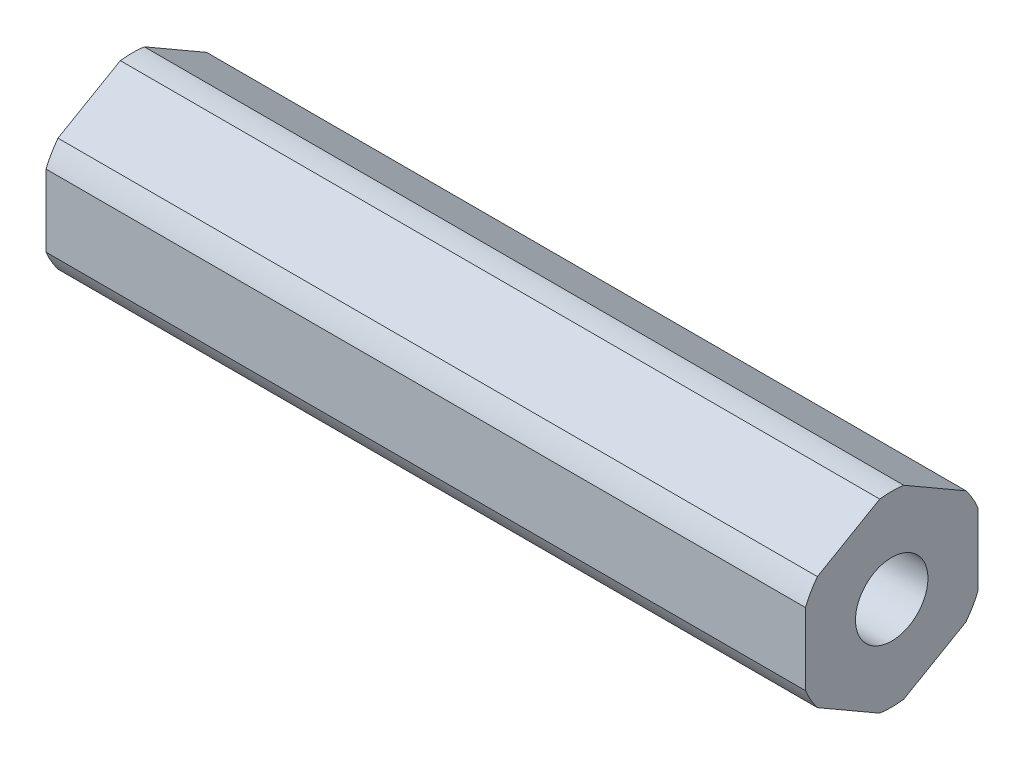
ISO-10303-21;
HEADER;
FILE_DESCRIPTION(('STEP AP214'),'2;1');
FILE_NAME('part.step','',(''),(''),'','','');
FILE_SCHEMA(('AUTOMOTIVE_DESIGN { 1 0 10303 214 1 1 1 1 }'));
ENDSEC;
DATA;
#1=APPLICATION_CONTEXT('core data for automotive mechanical design processes');
#2=APPLICATION_PROTOCOL_DEFINITION('international standard','automotive_design',2000,#1);
#3=PRODUCT_CONTEXT('',#1,'mechanical');
#4=PRODUCT('Part','Part','',(#3));
#5=PRODUCT_RELATED_PRODUCT_CATEGORY('part','',(#4));
#6=PRODUCT_DEFINITION_FORMATION('','',#4);
#7=PRODUCT_DEFINITION_CONTEXT('part definition',#1,'design');
#8=PRODUCT_DEFINITION('design','',#6,#7);
#9=PRODUCT_DEFINITION_SHAPE('','',#8);
#10=(LENGTH_UNIT() NAMED_UNIT(*) SI_UNIT(.MILLI.,.METRE.));
#11=(NAMED_UNIT(*) PLANE_ANGLE_UNIT() SI_UNIT($,.RADIAN.));
#12=(NAMED_UNIT(*) SI_UNIT($,.STERADIAN.) SOLID_ANGLE_UNIT());
#13=UNCERTAINTY_MEASURE_WITH_UNIT(LENGTH_MEASURE(1.E-05),#10,'distance_accuracy_value','');
#14=(GEOMETRIC_REPRESENTATION_CONTEXT(3) GLOBAL_UNCERTAINTY_ASSIGNED_CONTEXT((#13)) GLOBAL_UNIT_ASSIGNED_CONTEXT((#10,
#11,#12)) REPRESENTATION_CONTEXT('',''));
#15=CARTESIAN_POINT('',(0.,0.,0.));
#16=DIRECTION('',(0.,0.,1.));
#17=DIRECTION('',(1.,0.,0.));
#18=AXIS2_PLACEMENT_3D('',#15,#16,#17);
#19=CARTESIAN_POINT('',(14.605,0.,5.64652491430451E-13));
#20=DIRECTION('',(-1.,0.,0.));
#21=DIRECTION('',(0.,0.,1.));
#22=AXIS2_PLACEMENT_3D('',#19,#20,#21);
#23=CYLINDRICAL_SURFACE('',#22,6.88000000000029);
#24=CARTESIAN_POINT('',(-41.275,0.,5.64652491430451E-13));
#25=DIRECTION('',(-1.,0.,0.));
#26=DIRECTION('',(0.,0.,1.));
#27=AXIS2_PLACEMENT_3D('',#24,#25,#26);
#28=CIRCLE('',#27,6.88000000000029);
#29=CARTESIAN_POINT('',(-41.275,-2.64799924471228,-6.35));
#30=VERTEX_POINT('',#29);
#31=CARTESIAN_POINT('',(-41.275,-4.17526169167448,-5.46823461512336));
#32=VERTEX_POINT('',#31);
#33=EDGE_CURVE('E154',#30,#32,#28,.T.);
#34=ORIENTED_EDGE('',*,*,#33,.F.);
#35=DIRECTION('',(-1.,0.,0.));
#36=VECTOR('',#35,1.);
#37=CARTESIAN_POINT('',(14.605,-2.64799924471228,-6.35));
#38=LINE('',#37,#36);
#39=CARTESIAN_POINT('',(14.605,-2.64799924471228,-6.35));
#40=VERTEX_POINT('',#39);
#41=EDGE_CURVE('E11',#40,#30,#38,.T.);
#42=ORIENTED_EDGE('',*,*,#41,.F.);
#43=CARTESIAN_POINT('',(14.605,0.,5.64652491430451E-13));
#44=DIRECTION('',(-1.,0.,0.));
#45=DIRECTION('',(0.,0.,1.));
#46=AXIS2_PLACEMENT_3D('',#43,#44,#45);
#47=CIRCLE('',#46,6.88000000000029);
#48=CARTESIAN_POINT('',(14.605,-4.17526169167448,-5.46823461512336));
#49=VERTEX_POINT('',#48);
#50=EDGE_CURVE('E187',#40,#49,#47,.T.);
#51=ORIENTED_EDGE('',*,*,#50,.T.);
#52=DIRECTION('',(-1.,0.,0.));
#53=VECTOR('',#52,1.);
#54=CARTESIAN_POINT('',(14.605,-4.17526169167448,-5.46823461512336));
#55=LINE('',#54,#53);
#56=EDGE_CURVE('E36',#49,#32,#55,.T.);
#57=ORIENTED_EDGE('',*,*,#56,.T.);
#58=EDGE_LOOP('',(#34,#42,#51,#57));
#59=FACE_BOUND('',#58,.T.);
#60=ADVANCED_FACE('F33',(#59),#23,.T.);
#61=CARTESIAN_POINT('',(14.605,2.64799924471228,-6.35));
#62=DIRECTION('',(0.,0.,-1.));
#63=DIRECTION('',(-1.,0.,0.));
#64=AXIS2_PLACEMENT_3D('',#61,#62,#63);
#65=PLANE('',#64);
#66=DIRECTION('',(0.,-1.,0.));
#67=VECTOR('',#66,1.);
#68=CARTESIAN_POINT('',(-41.275,2.64799924471228,-6.35));
#69=LINE('',#68,#67);
#70=CARTESIAN_POINT('',(-41.275,2.64799924471228,-6.35));
#71=VERTEX_POINT('',#70);
#72=EDGE_CURVE('E185',#71,#30,#69,.T.);
#73=ORIENTED_EDGE('',*,*,#72,.F.);
#74=DIRECTION('',(-1.,0.,0.));
#75=VECTOR('',#74,1.);
#76=CARTESIAN_POINT('',(14.605,2.64799924471228,-6.35));
#77=LINE('',#76,#75);
#78=CARTESIAN_POINT('',(14.605,2.64799924471228,-6.35));
#79=VERTEX_POINT('',#78);
#80=EDGE_CURVE('E42',#79,#71,#77,.T.);
#81=ORIENTED_EDGE('',*,*,#80,.F.);
#82=DIRECTION('',(0.,-1.,0.));
#83=VECTOR('',#82,1.);
#84=CARTESIAN_POINT('',(14.605,2.64799924471228,-6.35));
#85=LINE('',#84,#83);
#86=EDGE_CURVE('E144',#79,#40,#85,.T.);
#87=ORIENTED_EDGE('',*,*,#86,.T.);
#88=ORIENTED_EDGE('',*,*,#41,.T.);
#89=EDGE_LOOP('',(#73,#81,#87,#88));
#90=FACE_BOUND('',#89,.T.);
#91=ADVANCED_FACE('F207',(#90),#65,.T.);
#92=CARTESIAN_POINT('',(14.605,0.,5.64652491430451E-13));
#93=DIRECTION('',(-1.,0.,0.));
#94=DIRECTION('',(0.,0.,1.));
#95=AXIS2_PLACEMENT_3D('',#92,#93,#94);
#96=CYLINDRICAL_SURFACE('',#95,6.88000000000029);
#97=CARTESIAN_POINT('',(-41.275,0.,5.64652491430451E-13));
#98=DIRECTION('',(-1.,0.,0.));
#99=DIRECTION('',(0.,0.,1.));
#100=AXIS2_PLACEMENT_3D('',#97,#98,#99);
#101=CIRCLE('',#100,6.88000000000029);
#102=CARTESIAN_POINT('',(-41.275,4.17526169167448,-5.46823461512336));
#103=VERTEX_POINT('',#102);
#104=EDGE_CURVE('E131',#103,#71,#101,.T.);
#105=ORIENTED_EDGE('',*,*,#104,.F.);
#106=DIRECTION('',(-1.,0.,0.));
#107=VECTOR('',#106,1.);
#108=CARTESIAN_POINT('',(14.605,4.17526169167448,-5.46823461512336));
#109=LINE('',#108,#107);
#110=CARTESIAN_POINT('',(14.605,4.17526169167448,-5.46823461512336));
#111=VERTEX_POINT('',#110);
#112=EDGE_CURVE('E126',#111,#103,#109,.T.);
#113=ORIENTED_EDGE('',*,*,#112,.F.);
#114=CARTESIAN_POINT('',(14.605,0.,5.64652491430451E-13));
#115=DIRECTION('',(-1.,0.,0.));
#116=DIRECTION('',(0.,0.,1.));
#117=AXIS2_PLACEMENT_3D('',#114,#115,#116);
#118=CIRCLE('',#117,6.88000000000029);
#119=EDGE_CURVE('E129',#111,#79,#118,.T.);
#120=ORIENTED_EDGE('',*,*,#119,.T.);
#121=ORIENTED_EDGE('',*,*,#80,.T.);
#122=EDGE_LOOP('',(#105,#113,#120,#121));
#123=FACE_BOUND('',#122,.T.);
#124=ADVANCED_FACE('F128',(#123),#96,.T.);
#125=CARTESIAN_POINT('',(14.605,6.8232609363879,-0.881765384876217));
#126=DIRECTION('',(0.,0.866025403784415,-0.500000000000042));
#127=DIRECTION('',(0.,0.500000000000042,0.866025403784415));
#128=AXIS2_PLACEMENT_3D('',#125,#126,#127);
#129=PLANE('',#128);
#130=DIRECTION('',(0.,-0.500000000000042,-0.866025403784415));
#131=VECTOR('',#130,1.);
#132=CARTESIAN_POINT('',(-41.275,6.8232609363879,-0.881765384876217));
#133=LINE('',#132,#131);
#134=CARTESIAN_POINT('',(-41.275,6.8232609363879,-0.881765384876217));
#135=VERTEX_POINT('',#134);
#136=EDGE_CURVE('E182',#135,#103,#133,.T.);
#137=ORIENTED_EDGE('',*,*,#136,.F.);
#138=DIRECTION('',(-1.,0.,0.));
#139=VECTOR('',#138,1.);
#140=CARTESIAN_POINT('',(14.605,6.8232609363879,-0.881765384876217));
#141=LINE('',#140,#139);
#142=CARTESIAN_POINT('',(14.605,6.8232609363879,-0.881765384876217));
#143=VERTEX_POINT('',#142);
#144=EDGE_CURVE('E136',#143,#135,#141,.T.);
#145=ORIENTED_EDGE('',*,*,#144,.F.);
#146=DIRECTION('',(0.,-0.500000000000042,-0.866025403784415));
#147=VECTOR('',#146,1.);
#148=CARTESIAN_POINT('',(14.605,6.8232609363879,-0.881765384876217));
#149=LINE('',#148,#147);
#150=EDGE_CURVE('E142',#143,#111,#149,.T.);
#151=ORIENTED_EDGE('',*,*,#150,.T.);
#152=ORIENTED_EDGE('',*,*,#112,.T.);
#153=EDGE_LOOP('',(#137,#145,#151,#152));
#154=FACE_BOUND('',#153,.T.);
#155=ADVANCED_FACE('F146',(#154),#129,.T.);
#156=CARTESIAN_POINT('',(14.605,0.,5.64652491430451E-13));
#157=DIRECTION('',(-1.,0.,0.));
#158=DIRECTION('',(0.,0.,1.));
#159=AXIS2_PLACEMENT_3D('',#156,#157,#158);
#160=CYLINDRICAL_SURFACE('',#159,6.88000000000029);
#161=CARTESIAN_POINT('',(-41.275,0.,5.64652491430451E-13));
#162=DIRECTION('',(-1.,0.,0.));
#163=DIRECTION('',(0.,0.,1.));
#164=AXIS2_PLACEMENT_3D('',#161,#162,#163);
#165=CIRCLE('',#164,6.88000000000029);
#166=CARTESIAN_POINT('',(-41.275,6.8232609363879,0.881765384877347));
#167=VERTEX_POINT('',#166);
#168=EDGE_CURVE('E179',#167,#135,#165,.T.);
#169=ORIENTED_EDGE('',*,*,#168,.F.);
#170=DIRECTION('',(-1.,0.,0.));
#171=VECTOR('',#170,1.);
#172=CARTESIAN_POINT('',(14.605,6.8232609363879,0.881765384877347));
#173=LINE('',#172,#171);
#174=CARTESIAN_POINT('',(14.605,6.8232609363879,0.881765384877347));
#175=VERTEX_POINT('',#174);
#176=EDGE_CURVE('E191',#175,#167,#173,.T.);
#177=ORIENTED_EDGE('',*,*,#176,.F.);
#178=CARTESIAN_POINT('',(14.605,0.,5.64652491430451E-13));
#179=DIRECTION('',(-1.,0.,0.));
#180=DIRECTION('',(0.,0.,1.));
#181=AXIS2_PLACEMENT_3D('',#178,#179,#180);
#182=CIRCLE('',#181,6.88000000000029);
#183=EDGE_CURVE('E147',#175,#143,#182,.T.);
#184=ORIENTED_EDGE('',*,*,#183,.T.);
#185=ORIENTED_EDGE('',*,*,#144,.T.);
#186=EDGE_LOOP('',(#169,#177,#184,#185));
#187=FACE_BOUND('',#186,.T.);
#188=ADVANCED_FACE('F220',(#187),#160,.T.);
#189=CARTESIAN_POINT('',(14.605,4.17526169167448,5.46823461512449));
#190=DIRECTION('',(0.,0.866025403784415,0.500000000000042));
#191=DIRECTION('',(0.,-0.500000000000042,0.866025403784415));
#192=AXIS2_PLACEMENT_3D('',#189,#190,#191);
#193=PLANE('',#192);
#194=DIRECTION('',(0.,0.500000000000042,-0.866025403784415));
#195=VECTOR('',#194,1.);
#196=CARTESIAN_POINT('',(-41.275,4.17526169167448,5.46823461512449));
#197=LINE('',#196,#195);
#198=CARTESIAN_POINT('',(-41.275,4.17526169167448,5.46823461512449));
#199=VERTEX_POINT('',#198);
#200=EDGE_CURVE('E176',#199,#167,#197,.T.);
#201=ORIENTED_EDGE('',*,*,#200,.F.);
#202=DIRECTION('',(-1.,0.,0.));
#203=VECTOR('',#202,1.);
#204=CARTESIAN_POINT('',(14.605,4.17526169167448,5.46823461512449));
#205=LINE('',#204,#203);
#206=CARTESIAN_POINT('',(14.605,4.17526169167448,5.46823461512449));
#207=VERTEX_POINT('',#206);
#208=EDGE_CURVE('E193',#207,#199,#205,.T.);
#209=ORIENTED_EDGE('',*,*,#208,.F.);
#210=DIRECTION('',(0.,0.500000000000042,-0.866025403784415));
#211=VECTOR('',#210,1.);
#212=CARTESIAN_POINT('',(14.605,4.17526169167448,5.46823461512449));
#213=LINE('',#212,#211);
#214=EDGE_CURVE('E149',#207,#175,#213,.T.);
#215=ORIENTED_EDGE('',*,*,#214,.T.);
#216=ORIENTED_EDGE('',*,*,#176,.T.);
#217=EDGE_LOOP('',(#201,#209,#215,#216));
#218=FACE_BOUND('',#217,.T.);
#219=ADVANCED_FACE('F223',(#218),#193,.T.);
#220=CARTESIAN_POINT('',(14.605,0.,5.64652491430451E-13));
#221=DIRECTION('',(-1.,0.,0.));
#222=DIRECTION('',(0.,0.,1.));
#223=AXIS2_PLACEMENT_3D('',#220,#221,#222);
#224=CYLINDRICAL_SURFACE('',#223,6.88000000000029);
#225=CARTESIAN_POINT('',(-41.275,0.,5.64652491430451E-13));
#226=DIRECTION('',(-1.,0.,0.));
#227=DIRECTION('',(0.,0.,1.));
#228=AXIS2_PLACEMENT_3D('',#225,#226,#227);
#229=CIRCLE('',#228,6.88000000000029);
#230=CARTESIAN_POINT('',(-41.275,2.64799924471248,6.35000000000105));
#231=VERTEX_POINT('',#230);
#232=EDGE_CURVE('E173',#231,#199,#229,.T.);
#233=ORIENTED_EDGE('',*,*,#232,.F.);
#234=DIRECTION('',(-1.,0.,0.));
#235=VECTOR('',#234,1.);
#236=CARTESIAN_POINT('',(14.605,2.64799924471248,6.35000000000105));
#237=LINE('',#236,#235);
#238=CARTESIAN_POINT('',(14.605,2.64799924471248,6.35000000000105));
#239=VERTEX_POINT('',#238);
#240=EDGE_CURVE('E195',#239,#231,#237,.T.);
#241=ORIENTED_EDGE('',*,*,#240,.F.);
#242=CARTESIAN_POINT('',(14.605,0.,5.64652491430451E-13));
#243=DIRECTION('',(-1.,0.,0.));
#244=DIRECTION('',(0.,0.,1.));
#245=AXIS2_PLACEMENT_3D('',#242,#243,#244);
#246=CIRCLE('',#245,6.88000000000029);
#247=EDGE_CURVE('E286',#239,#207,#246,.T.);
#248=ORIENTED_EDGE('',*,*,#247,.T.);
#249=ORIENTED_EDGE('',*,*,#208,.T.);
#250=EDGE_LOOP('',(#233,#241,#248,#249));
#251=FACE_BOUND('',#250,.T.);
#252=ADVANCED_FACE('F227',(#251),#224,.T.);
#253=CARTESIAN_POINT('',(14.605,-2.64799924471248,6.35000000000105));
#254=DIRECTION('',(0.,0.,1.));
#255=DIRECTION('',(0.,-1.,0.));
#256=AXIS2_PLACEMENT_3D('',#253,#254,#255);
#257=PLANE('',#256);
#258=DIRECTION('',(0.,1.,0.));
#259=VECTOR('',#258,1.);
#260=CARTESIAN_POINT('',(-41.275,-2.64799924471248,6.35000000000105));
#261=LINE('',#260,#259);
#262=CARTESIAN_POINT('',(-41.275,-2.64799924471248,6.35000000000105));
#263=VERTEX_POINT('',#262);
#264=EDGE_CURVE('E170',#263,#231,#261,.T.);
#265=ORIENTED_EDGE('',*,*,#264,.F.);
#266=DIRECTION('',(-1.,0.,0.));
#267=VECTOR('',#266,1.);
#268=CARTESIAN_POINT('',(14.605,-2.64799924471248,6.35000000000105));
#269=LINE('',#268,#267);
#270=CARTESIAN_POINT('',(14.605,-2.64799924471248,6.35000000000105));
#271=VERTEX_POINT('',#270);
#272=EDGE_CURVE('E197',#271,#263,#269,.T.);
#273=ORIENTED_EDGE('',*,*,#272,.F.);
#274=DIRECTION('',(0.,1.,0.));
#275=VECTOR('',#274,1.);
#276=CARTESIAN_POINT('',(14.605,-2.64799924471248,6.35000000000105));
#277=LINE('',#276,#275);
#278=EDGE_CURVE('E283',#271,#239,#277,.T.);
#279=ORIENTED_EDGE('',*,*,#278,.T.);
#280=ORIENTED_EDGE('',*,*,#240,.T.);
#281=EDGE_LOOP('',(#265,#273,#279,#280));
#282=FACE_BOUND('',#281,.T.);
#283=ADVANCED_FACE('F231',(#282),#257,.T.);
#284=CARTESIAN_POINT('',(14.605,0.,5.64652491430451E-13));
#285=DIRECTION('',(-1.,0.,0.));
#286=DIRECTION('',(0.,0.,1.));
#287=AXIS2_PLACEMENT_3D('',#284,#285,#286);
#288=CYLINDRICAL_SURFACE('',#287,6.88000000000029);
#289=CARTESIAN_POINT('',(-41.275,0.,5.64652491430451E-13));
#290=DIRECTION('',(-1.,0.,0.));
#291=DIRECTION('',(0.,0.,1.));
#292=AXIS2_PLACEMENT_3D('',#289,#290,#291);
#293=CIRCLE('',#292,6.88000000000029);
#294=CARTESIAN_POINT('',(-41.275,-4.17526169167448,5.46823461512449));
#295=VERTEX_POINT('',#294);
#296=EDGE_CURVE('E167',#295,#263,#293,.T.);
#297=ORIENTED_EDGE('',*,*,#296,.F.);
#298=DIRECTION('',(-1.,0.,0.));
#299=VECTOR('',#298,1.);
#300=CARTESIAN_POINT('',(14.605,-4.17526169167448,5.46823461512449));
#301=LINE('',#300,#299);
#302=CARTESIAN_POINT('',(14.605,-4.17526169167448,5.46823461512449));
#303=VERTEX_POINT('',#302);
#304=EDGE_CURVE('E199',#303,#295,#301,.T.);
#305=ORIENTED_EDGE('',*,*,#304,.F.);
#306=CARTESIAN_POINT('',(14.605,0.,5.64652491430451E-13));
#307=DIRECTION('',(-1.,0.,0.));
#308=DIRECTION('',(0.,0.,1.));
#309=AXIS2_PLACEMENT_3D('',#306,#307,#308);
#310=CIRCLE('',#309,6.88000000000029);
#311=EDGE_CURVE('E280',#303,#271,#310,.T.);
#312=ORIENTED_EDGE('',*,*,#311,.T.);
#313=ORIENTED_EDGE('',*,*,#272,.T.);
#314=EDGE_LOOP('',(#297,#305,#312,#313));
#315=FACE_BOUND('',#314,.T.);
#316=ADVANCED_FACE('F235',(#315),#288,.T.);
#317=CARTESIAN_POINT('',(14.605,-6.8232609363879,0.881765384877347));
#318=DIRECTION('',(0.,-0.866025403784415,0.500000000000042));
#319=DIRECTION('',(0.,-0.500000000000042,-0.866025403784415));
#320=AXIS2_PLACEMENT_3D('',#317,#318,#319);
#321=PLANE('',#320);
#322=DIRECTION('',(0.,0.500000000000042,0.866025403784415));
#323=VECTOR('',#322,1.);
#324=CARTESIAN_POINT('',(-41.275,-6.8232609363879,0.881765384877347));
#325=LINE('',#324,#323);
#326=CARTESIAN_POINT('',(-41.275,-6.8232609363879,0.881765384877347));
#327=VERTEX_POINT('',#326);
#328=EDGE_CURVE('E164',#327,#295,#325,.T.);
#329=ORIENTED_EDGE('',*,*,#328,.F.);
#330=DIRECTION('',(-1.,0.,0.));
#331=VECTOR('',#330,1.);
#332=CARTESIAN_POINT('',(14.605,-6.8232609363879,0.881765384877347));
#333=LINE('',#332,#331);
#334=CARTESIAN_POINT('',(14.605,-6.8232609363879,0.881765384877347));
#335=VERTEX_POINT('',#334);
#336=EDGE_CURVE('E201',#335,#327,#333,.T.);
#337=ORIENTED_EDGE('',*,*,#336,.F.);
#338=DIRECTION('',(0.,0.500000000000042,0.866025403784415));
#339=VECTOR('',#338,1.);
#340=CARTESIAN_POINT('',(14.605,-6.8232609363879,0.881765384877347));
#341=LINE('',#340,#339);
#342=EDGE_CURVE('E277',#335,#303,#341,.T.);
#343=ORIENTED_EDGE('',*,*,#342,.T.);
#344=ORIENTED_EDGE('',*,*,#304,.T.);
#345=EDGE_LOOP('',(#329,#337,#343,#344));
#346=FACE_BOUND('',#345,.T.);
#347=ADVANCED_FACE('F239',(#346),#321,.T.);
#348=CARTESIAN_POINT('',(14.605,0.,5.64652491430451E-13));
#349=DIRECTION('',(-1.,0.,0.));
#350=DIRECTION('',(0.,0.,1.));
#351=AXIS2_PLACEMENT_3D('',#348,#349,#350);
#352=CYLINDRICAL_SURFACE('',#351,6.88000000000029);
#353=CARTESIAN_POINT('',(-41.275,0.,5.64652491430451E-13));
#354=DIRECTION('',(-1.,0.,0.));
#355=DIRECTION('',(0.,0.,1.));
#356=AXIS2_PLACEMENT_3D('',#353,#354,#355);
#357=CIRCLE('',#356,6.88000000000029);
#358=CARTESIAN_POINT('',(-41.275,-6.8232609363879,-0.881765384876218));
#359=VERTEX_POINT('',#358);
#360=EDGE_CURVE('E161',#359,#327,#357,.T.);
#361=ORIENTED_EDGE('',*,*,#360,.F.);
#362=DIRECTION('',(-1.,0.,0.));
#363=VECTOR('',#362,1.);
#364=CARTESIAN_POINT('',(14.605,-6.8232609363879,-0.881765384876218));
#365=LINE('',#364,#363);
#366=CARTESIAN_POINT('',(14.605,-6.8232609363879,-0.881765384876218));
#367=VERTEX_POINT('',#366);
#368=EDGE_CURVE('E202',#367,#359,#365,.T.);
#369=ORIENTED_EDGE('',*,*,#368,.F.);
#370=CARTESIAN_POINT('',(14.605,0.,5.64652491430451E-13));
#371=DIRECTION('',(-1.,0.,0.));
#372=DIRECTION('',(0.,0.,1.));
#373=AXIS2_PLACEMENT_3D('',#370,#371,#372);
#374=CIRCLE('',#373,6.88000000000029);
#375=EDGE_CURVE('E274',#367,#335,#374,.T.);
#376=ORIENTED_EDGE('',*,*,#375,.T.);
#377=ORIENTED_EDGE('',*,*,#336,.T.);
#378=EDGE_LOOP('',(#361,#369,#376,#377));
#379=FACE_BOUND('',#378,.T.);
#380=ADVANCED_FACE('F243',(#379),#352,.T.);
#381=CARTESIAN_POINT('',(14.605,-4.17526169167448,-5.46823461512336));
#382=DIRECTION('',(0.,-0.866025403784415,-0.500000000000042));
#383=DIRECTION('',(0.,0.500000000000042,-0.866025403784415));
#384=AXIS2_PLACEMENT_3D('',#381,#382,#383);
#385=PLANE('',#384);
#386=DIRECTION('',(0.,-0.500000000000042,0.866025403784415));
#387=VECTOR('',#386,1.);
#388=CARTESIAN_POINT('',(-41.275,-4.17526169167448,-5.46823461512336));
#389=LINE('',#388,#387);
#390=EDGE_CURVE('E157',#32,#359,#389,.T.);
#391=ORIENTED_EDGE('',*,*,#390,.F.);
#392=ORIENTED_EDGE('',*,*,#56,.F.);
#393=DIRECTION('',(0.,-0.500000000000042,0.866025403784415));
#394=VECTOR('',#393,1.);
#395=CARTESIAN_POINT('',(14.605,-4.17526169167448,-5.46823461512336));
#396=LINE('',#395,#394);
#397=EDGE_CURVE('E272',#49,#367,#396,.T.);
#398=ORIENTED_EDGE('',*,*,#397,.T.);
#399=ORIENTED_EDGE('',*,*,#368,.T.);
#400=EDGE_LOOP('',(#391,#392,#398,#399));
#401=FACE_BOUND('',#400,.T.);
#402=ADVANCED_FACE('F204',(#401),#385,.T.);
#403=CARTESIAN_POINT('',(14.605,0.,5.64652491430451E-13));
#404=DIRECTION('',(-1.,0.,0.));
#405=DIRECTION('',(0.,0.,1.));
#406=AXIS2_PLACEMENT_3D('',#403,#404,#405);
#407=PLANE('',#406);
#408=CARTESIAN_POINT('',(14.605,0.,5.64652491430451E-13));
#409=DIRECTION('',(-1.,0.,0.));
#410=DIRECTION('',(0.,0.,-1.));
#411=AXIS2_PLACEMENT_3D('',#408,#409,#410);
#412=CIRCLE('',#411,2.66700000000056);
#413=CARTESIAN_POINT('',(14.605,0.,-2.667));
#414=VERTEX_POINT('',#413);
#415=EDGE_CURVE('E158',#414,#414,#412,.T.);
#416=ORIENTED_EDGE('',*,*,#415,.T.);
#417=EDGE_LOOP('',(#416));
#418=FACE_BOUND('',#417,.T.);
#419=ORIENTED_EDGE('',*,*,#50,.F.);
#420=ORIENTED_EDGE('',*,*,#86,.F.);
#421=ORIENTED_EDGE('',*,*,#119,.F.);
#422=ORIENTED_EDGE('',*,*,#150,.F.);
#423=ORIENTED_EDGE('',*,*,#183,.F.);
#424=ORIENTED_EDGE('',*,*,#214,.F.);
#425=ORIENTED_EDGE('',*,*,#247,.F.);
#426=ORIENTED_EDGE('',*,*,#278,.F.);
#427=ORIENTED_EDGE('',*,*,#311,.F.);
#428=ORIENTED_EDGE('',*,*,#342,.F.);
#429=ORIENTED_EDGE('',*,*,#375,.F.);
#430=ORIENTED_EDGE('',*,*,#397,.F.);
#431=EDGE_LOOP('',(#419,#420,#421,#422,#423,#424,#425,#426,#427,#428,#429,#430));
#432=FACE_BOUND('',#431,.T.);
#433=ADVANCED_FACE('F140',(#418,#432),#407,.F.);
#434=CARTESIAN_POINT('',(-41.275,0.,5.64652491430451E-13));
#435=DIRECTION('',(-1.,0.,0.));
#436=DIRECTION('',(0.,0.,1.));
#437=AXIS2_PLACEMENT_3D('',#434,#435,#436);
#438=PLANE('',#437);
#439=CARTESIAN_POINT('',(-41.275,0.,5.64652491430451E-13));
#440=DIRECTION('',(-1.,0.,0.));
#441=DIRECTION('',(0.,0.,-1.));
#442=AXIS2_PLACEMENT_3D('',#439,#440,#441);
#443=CIRCLE('',#442,2.66700000000056);
#444=CARTESIAN_POINT('',(-41.275,0.,-2.667));
#445=VERTEX_POINT('',#444);
#446=EDGE_CURVE('E267',#445,#445,#443,.T.);
#447=ORIENTED_EDGE('',*,*,#446,.F.);
#448=EDGE_LOOP('',(#447));
#449=FACE_BOUND('',#448,.T.);
#450=ORIENTED_EDGE('',*,*,#33,.T.);
#451=ORIENTED_EDGE('',*,*,#390,.T.);
#452=ORIENTED_EDGE('',*,*,#360,.T.);
#453=ORIENTED_EDGE('',*,*,#328,.T.);
#454=ORIENTED_EDGE('',*,*,#296,.T.);
#455=ORIENTED_EDGE('',*,*,#264,.T.);
#456=ORIENTED_EDGE('',*,*,#232,.T.);
#457=ORIENTED_EDGE('',*,*,#200,.T.);
#458=ORIENTED_EDGE('',*,*,#168,.T.);
#459=ORIENTED_EDGE('',*,*,#136,.T.);
#460=ORIENTED_EDGE('',*,*,#104,.T.);
#461=ORIENTED_EDGE('',*,*,#72,.T.);
#462=EDGE_LOOP('',(#450,#451,#452,#453,#454,#455,#456,#457,#458,#459,#460,#461));
#463=FACE_BOUND('',#462,.T.);
#464=ADVANCED_FACE('F206',(#449,#463),#438,.T.);
#465=CARTESIAN_POINT('',(14.605,0.,5.64652491430451E-13));
#466=DIRECTION('',(-1.,0.,0.));
#467=DIRECTION('',(0.,0.,1.));
#468=AXIS2_PLACEMENT_3D('',#465,#466,#467);
#469=CYLINDRICAL_SURFACE('',#468,2.66700000000056);
#470=ORIENTED_EDGE('',*,*,#415,.F.);
#471=EDGE_LOOP('',(#470));
#472=FACE_BOUND('',#471,.T.);
#473=ORIENTED_EDGE('',*,*,#446,.T.);
#474=EDGE_LOOP('',(#473));
#475=FACE_BOUND('',#474,.T.);
#476=ADVANCED_FACE('F255',(#472,#475),#469,.F.);
#477=CLOSED_SHELL('',(#60,#91,#124,#155,#188,#219,#252,#283,#316,#347,#380,#402,#433,#464,#476));
#478=MANIFOLD_SOLID_BREP('B2',#477);
#479=ADVANCED_BREP_SHAPE_REPRESENTATION('',(#18,#478),#14);
#480=SHAPE_DEFINITION_REPRESENTATION(#9,#479);
ENDSEC;
END-ISO-10303-21;
